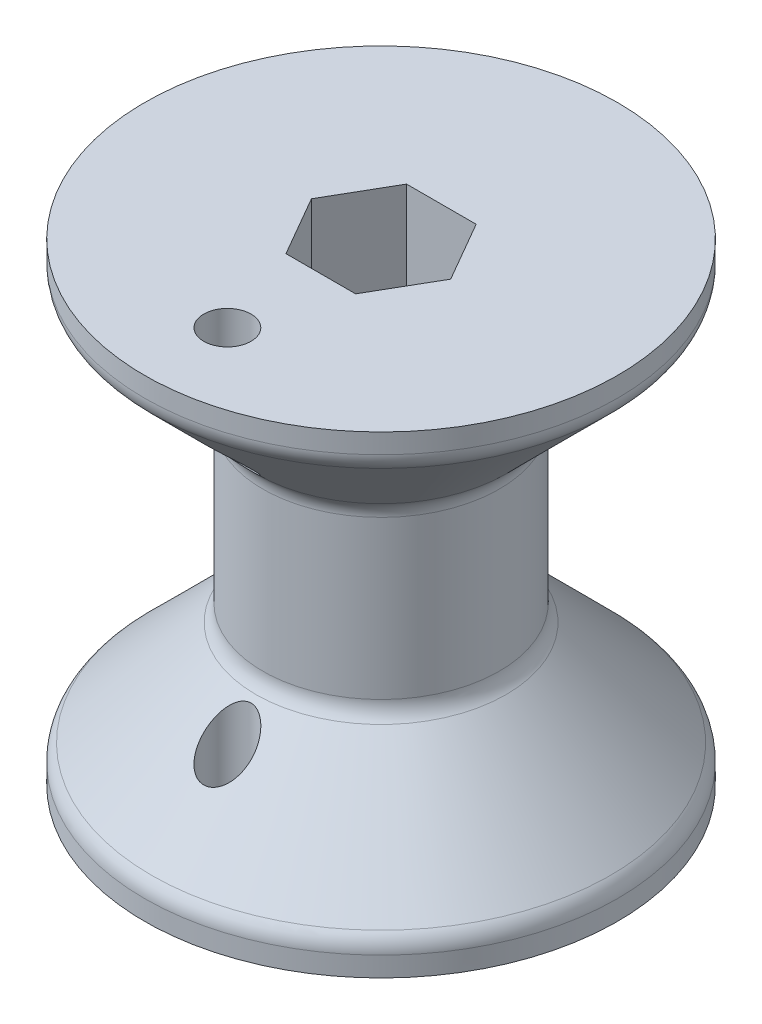
ISO-10303-21;
HEADER;
FILE_DESCRIPTION(('STEP AP214'),'2;1');
FILE_NAME('part.step','',(''),(''),'','','');
FILE_SCHEMA(('AUTOMOTIVE_DESIGN { 1 0 10303 214 1 1 1 1 }'));
ENDSEC;
DATA;
#1=APPLICATION_CONTEXT('core data for automotive mechanical design processes');
#2=APPLICATION_PROTOCOL_DEFINITION('international standard','automotive_design',2000,#1);
#3=PRODUCT_CONTEXT('',#1,'mechanical');
#4=PRODUCT('Part','Part','',(#3));
#5=PRODUCT_RELATED_PRODUCT_CATEGORY('part','',(#4));
#6=PRODUCT_DEFINITION_FORMATION('','',#4);
#7=PRODUCT_DEFINITION_CONTEXT('part definition',#1,'design');
#8=PRODUCT_DEFINITION('design','',#6,#7);
#9=PRODUCT_DEFINITION_SHAPE('','',#8);
#10=(LENGTH_UNIT() NAMED_UNIT(*) SI_UNIT(.MILLI.,.METRE.));
#11=(NAMED_UNIT(*) PLANE_ANGLE_UNIT() SI_UNIT($,.RADIAN.));
#12=(NAMED_UNIT(*) SI_UNIT($,.STERADIAN.) SOLID_ANGLE_UNIT());
#13=UNCERTAINTY_MEASURE_WITH_UNIT(LENGTH_MEASURE(1.E-05),#10,'distance_accuracy_value','');
#14=(GEOMETRIC_REPRESENTATION_CONTEXT(3) GLOBAL_UNCERTAINTY_ASSIGNED_CONTEXT((#13)) GLOBAL_UNIT_ASSIGNED_CONTEXT((#10,
#11,#12)) REPRESENTATION_CONTEXT('',''));
#15=CARTESIAN_POINT('',(0.,0.,0.));
#16=DIRECTION('',(0.,0.,1.));
#17=DIRECTION('',(1.,0.,0.));
#18=AXIS2_PLACEMENT_3D('',#15,#16,#17);
#19=CARTESIAN_POINT('',(0.,25.4,0.));
#20=DIRECTION('',(0.,1.,0.));
#21=DIRECTION('',(0.,0.,1.));
#22=AXIS2_PLACEMENT_3D('',#19,#20,#21);
#23=PLANE('',#22);
#24=DIRECTION('',(-0.5,0.,0.866025403784439));
#25=VECTOR('',#24,1.);
#26=CARTESIAN_POINT('',(-3.73949769354121,25.4,-6.47700000000001));
#27=LINE('',#26,#25);
#28=CARTESIAN_POINT('',(-3.73949769354121,25.4,-6.47700000000001));
#29=VERTEX_POINT('',#28);
#30=CARTESIAN_POINT('',(-7.47899538708242,25.4,0.));
#31=VERTEX_POINT('',#30);
#32=EDGE_CURVE('E52',#29,#31,#27,.T.);
#33=ORIENTED_EDGE('',*,*,#32,.F.);
#34=DIRECTION('',(-1.,0.,0.));
#35=VECTOR('',#34,1.);
#36=CARTESIAN_POINT('',(3.7394976935412,25.4,-6.47700000000001));
#37=LINE('',#36,#35);
#38=CARTESIAN_POINT('',(3.7394976935412,25.4,-6.47700000000001));
#39=VERTEX_POINT('',#38);
#40=EDGE_CURVE('E109',#39,#29,#37,.T.);
#41=ORIENTED_EDGE('',*,*,#40,.F.);
#42=DIRECTION('',(-0.5,0.,-0.866025403784438));
#43=VECTOR('',#42,1.);
#44=CARTESIAN_POINT('',(7.47899538708242,25.4,0.));
#45=LINE('',#44,#43);
#46=CARTESIAN_POINT('',(7.47899538708242,25.4,0.));
#47=VERTEX_POINT('',#46);
#48=EDGE_CURVE('E112',#47,#39,#45,.T.);
#49=ORIENTED_EDGE('',*,*,#48,.F.);
#50=DIRECTION('',(0.5,0.,-0.866025403784439));
#51=VECTOR('',#50,1.);
#52=CARTESIAN_POINT('',(3.73949769354121,25.4,6.477));
#53=LINE('',#52,#51);
#54=CARTESIAN_POINT('',(3.73949769354121,25.4,6.477));
#55=VERTEX_POINT('',#54);
#56=EDGE_CURVE('E129',#55,#47,#53,.T.);
#57=ORIENTED_EDGE('',*,*,#56,.F.);
#58=DIRECTION('',(1.,0.,0.));
#59=VECTOR('',#58,1.);
#60=CARTESIAN_POINT('',(-3.73949769354121,25.4,6.477));
#61=LINE('',#60,#59);
#62=CARTESIAN_POINT('',(-3.73949769354121,25.4,6.477));
#63=VERTEX_POINT('',#62);
#64=EDGE_CURVE('E126',#63,#55,#61,.T.);
#65=ORIENTED_EDGE('',*,*,#64,.F.);
#66=DIRECTION('',(0.5,0.,0.866025403784439));
#67=VECTOR('',#66,1.);
#68=CARTESIAN_POINT('',(-7.47899538708242,25.4,0.));
#69=LINE('',#68,#67);
#70=EDGE_CURVE('E123',#31,#63,#69,.T.);
#71=ORIENTED_EDGE('',*,*,#70,.F.);
#72=EDGE_LOOP('',(#33,#41,#49,#57,#65,#71));
#73=FACE_BOUND('',#72,.T.);
#74=CARTESIAN_POINT('',(0.,25.4,16.51));
#75=DIRECTION('',(0.,1.,0.));
#76=DIRECTION('',(0.,0.,1.));
#77=AXIS2_PLACEMENT_3D('',#74,#75,#76);
#78=CIRCLE('',#77,2.54);
#79=CARTESIAN_POINT('',(0.,25.4,19.05));
#80=VERTEX_POINT('',#79);
#81=EDGE_CURVE('E146',#80,#80,#78,.T.);
#82=ORIENTED_EDGE('',*,*,#81,.F.);
#83=EDGE_LOOP('',(#82));
#84=FACE_BOUND('',#83,.T.);
#85=CARTESIAN_POINT('',(0.,25.4,0.));
#86=DIRECTION('',(0.,-1.,0.));
#87=DIRECTION('',(0.,0.,-1.));
#88=AXIS2_PLACEMENT_3D('',#85,#86,#87);
#89=CIRCLE('',#88,25.4);
#90=CARTESIAN_POINT('',(0.,25.4,-25.4));
#91=VERTEX_POINT('',#90);
#92=EDGE_CURVE('E181',#91,#91,#89,.T.);
#93=ORIENTED_EDGE('',*,*,#92,.F.);
#94=EDGE_LOOP('',(#93));
#95=FACE_BOUND('',#94,.T.);
#96=ADVANCED_FACE('F37',(#73,#84,#95),#23,.T.);
#97=CARTESIAN_POINT('',(0.,0.,0.));
#98=DIRECTION('',(0.,-1.,0.));
#99=DIRECTION('',(0.,0.,-1.));
#100=AXIS2_PLACEMENT_3D('',#97,#98,#99);
#101=CYLINDRICAL_SURFACE('',#100,25.4);
#102=CARTESIAN_POINT('',(0.,23.2771024484277,0.));
#103=DIRECTION('',(0.,1.,0.));
#104=DIRECTION('',(0.,0.,1.));
#105=AXIS2_PLACEMENT_3D('',#102,#103,#104);
#106=CIRCLE('',#105,25.4);
#107=CARTESIAN_POINT('',(0.,23.2771024484277,25.4));
#108=VERTEX_POINT('',#107);
#109=EDGE_CURVE('E45',#108,#108,#106,.T.);
#110=ORIENTED_EDGE('',*,*,#109,.T.);
#111=EDGE_LOOP('',(#110));
#112=FACE_BOUND('',#111,.T.);
#113=ORIENTED_EDGE('',*,*,#92,.T.);
#114=EDGE_LOOP('',(#113));
#115=FACE_BOUND('',#114,.T.);
#116=ADVANCED_FACE('F202',(#112,#115),#101,.T.);
#117=CARTESIAN_POINT('',(0.,9.52500000000003,0.));
#118=DIRECTION('',(0.,1.,0.));
#119=DIRECTION('',(0.,0.,1.));
#120=AXIS2_PLACEMENT_3D('',#117,#118,#119);
#121=CONICAL_SURFACE('',#120,12.7,0.78539816339745);
#122=CARTESIAN_POINT('',(0.,10.2689487757862,0.));
#123=DIRECTION('',(0.,1.,0.));
#124=DIRECTION('',(0.,0.,1.));
#125=AXIS2_PLACEMENT_3D('',#122,#123,#124);
#126=CIRCLE('',#125,13.4439487757862);
#127=CARTESIAN_POINT('',(0.,10.2689487757862,13.4439487757862));
#128=VERTEX_POINT('',#127);
#129=EDGE_CURVE('E197',#128,#128,#126,.T.);
#130=ORIENTED_EDGE('',*,*,#129,.T.);
#131=EDGE_LOOP('',(#130));
#132=FACE_BOUND('',#131,.T.);
#133=CARTESIAN_POINT('',(0.,21.4810512242138,0.));
#134=DIRECTION('',(0.,-1.,0.));
#135=DIRECTION('',(0.,0.,-1.));
#136=AXIS2_PLACEMENT_3D('',#133,#134,#135);
#137=CIRCLE('',#136,24.6560512242138);
#138=CARTESIAN_POINT('',(0.,21.4810512242138,-24.6560512242138));
#139=VERTEX_POINT('',#138);
#140=EDGE_CURVE('E194',#139,#139,#137,.T.);
#141=ORIENTED_EDGE('',*,*,#140,.T.);
#142=EDGE_LOOP('',(#141));
#143=FACE_BOUND('',#142,.T.);
#144=CARTESIAN_POINT('',(-1.30213218323772,11.2132055122847,14.3291611801462));
#145=CARTESIAN_POINT('',(-1.21914973875307,11.1563577149583,14.2796179845781));
#146=CARTESIAN_POINT('',(-1.13143632781732,11.1032793761864,14.233659280017));
#147=CARTESIAN_POINT('',(-0.946591137934634,11.0071483537464,14.1508038722713));
#148=CARTESIAN_POINT('',(-0.849461886110524,10.9640929905001,14.1139047469219));
#149=CARTESIAN_POINT('',(-0.645759834902397,10.8906002970199,14.0511273981558));
#150=CARTESIAN_POINT('',(-0.539097324176534,10.860302515397,14.0253709794981));
#151=CARTESIAN_POINT('',(-0.320083764626517,10.8160540235673,13.9878128629933));
#152=CARTESIAN_POINT('',(-0.207741497774353,10.8020788361032,13.9759902698287));
#153=CARTESIAN_POINT('',(0.00463253054322886,10.7927003845005,13.9680539929217));
#154=CARTESIAN_POINT('',(0.104515008313534,10.795260622735,13.9702177804299));
#155=CARTESIAN_POINT('',(0.302057493072186,10.8139915829359,13.9860781599932));
#156=CARTESIAN_POINT('',(0.399716941973742,10.8301656847621,13.9997776159632));
#157=CARTESIAN_POINT('',(0.584749804878773,10.8734142515183,14.0365237791391));
#158=CARTESIAN_POINT('',(0.672393312178411,10.899834710608,14.0590101877846));
#159=CARTESIAN_POINT('',(0.84182365437426,10.9617543998776,14.1119128912153));
#160=CARTESIAN_POINT('',(0.923608500483415,10.9972566944677,14.1423318626882));
#161=CARTESIAN_POINT('',(1.12408504518909,11.0972571020511,14.2284120236306));
#162=CARTESIAN_POINT('',(1.23819537731323,11.1669367542969,14.2887328506322));
#163=CARTESIAN_POINT('',(1.45043921176992,11.3185026988092,14.4210879884385));
#164=CARTESIAN_POINT('',(1.54852814403644,11.4004218691675,14.4931538980298));
#165=CARTESIAN_POINT('',(1.77130166281646,11.6122950820827,14.6813106001247));
#166=CARTESIAN_POINT('',(1.88731139758535,11.7469450388043,14.8023498440219));
#167=CARTESIAN_POINT('',(2.08971653166537,12.0261042098922,15.0570095698019));
#168=CARTESIAN_POINT('',(2.17606686854588,12.1706280300428,15.1906488060949));
#169=CARTESIAN_POINT('',(2.29563599054754,12.4132015112736,15.4182728856742));
#170=CARTESIAN_POINT('',(2.33686801145495,12.5097766048632,15.509730140138));
#171=CARTESIAN_POINT('',(2.40796487005604,12.7042408707439,15.695618121358));
#172=CARTESIAN_POINT('',(2.43782648851076,12.8021304070768,15.7900496820317));
#173=CARTESIAN_POINT('',(2.51058704277444,13.0968014004098,16.0769728823188));
#174=CARTESIAN_POINT('',(2.53666114431542,13.2945841352587,16.2730920031945));
#175=CARTESIAN_POINT('',(2.54122884940606,13.5892367939077,16.5705116898518));
#176=CARTESIAN_POINT('',(2.53691695316006,13.6874612428122,16.6705514180429));
#177=CARTESIAN_POINT('',(2.51625553594526,13.8824357573659,16.8708388378816));
#178=CARTESIAN_POINT('',(2.49990387816774,13.979185558184,16.9710865632946));
#179=CARTESIAN_POINT('',(2.43208557009613,14.2657362714508,17.2704920488992));
#180=CARTESIAN_POINT('',(2.36187208448898,14.4524923349533,17.4689732560816));
#181=CARTESIAN_POINT('',(2.20072467464285,14.7464026739209,17.7859361634635));
#182=CARTESIAN_POINT('',(2.12569352669345,14.858503689282,17.9080619434272));
#183=CARTESIAN_POINT('',(1.9507859331249,15.0725265032475,18.1432274507606));
#184=CARTESIAN_POINT('',(1.85094578883275,15.1744628723731,18.2562801372075));
#185=CARTESIAN_POINT('',(1.6495992371107,15.3436200154977,18.4452514751221));
#186=CARTESIAN_POINT('',(1.55302300882151,15.413601383906,18.523939114725));
#187=CARTESIAN_POINT('',(1.34409319790177,15.5419652401155,18.6689636884527));
#188=CARTESIAN_POINT('',(1.23175812381553,15.6003611433816,18.7353149019579));
#189=CARTESIAN_POINT('',(1.01315138647806,15.693744643535,18.8417994330508));
#190=CARTESIAN_POINT('',(0.909104218279211,15.7310249779408,18.8844732379608));
#191=CARTESIAN_POINT('',(0.692999623277539,15.793628212432,18.9562801584605));
#192=CARTESIAN_POINT('',(0.580946533831816,15.8189575314841,18.9854205428049));
#193=CARTESIAN_POINT('',(0.351140130421297,15.8562255731767,19.02833702905));
#194=CARTESIAN_POINT('',(0.233361638586016,15.8680982598893,19.0420373599055));
#195=CARTESIAN_POINT('',(-0.0035182675800703,15.8773928418893,19.0527603731164));
#196=CARTESIAN_POINT('',(-0.12261935521475,15.8748182299227,19.0497870864476));
#197=CARTESIAN_POINT('',(-0.348249445000713,15.8562312924504,19.0283523783546));
#198=CARTESIAN_POINT('',(-0.455002075093826,15.8413508141862,19.0111955494403));
#199=CARTESIAN_POINT('',(-0.663412847682085,15.800470368187,18.964159943528));
#200=CARTESIAN_POINT('',(-0.765070622899478,15.7744696000972,18.9342802508345));
#201=CARTESIAN_POINT('',(-0.965359263165174,15.7113160392668,18.8619140846544));
#202=CARTESIAN_POINT('',(-1.06368032990805,15.6737381429365,18.8189479250198));
#203=CARTESIAN_POINT('',(-1.25109205105706,15.5895283579198,18.7230238627116));
#204=CARTESIAN_POINT('',(-1.34017744284913,15.542891350246,18.6700603113416));
#205=CARTESIAN_POINT('',(-1.54627020280473,15.419439266011,18.5304776254792));
#206=CARTESIAN_POINT('',(-1.65781901922235,15.3384843643351,18.4394342163037));
#207=CARTESIAN_POINT('',(-1.85973357850447,15.1649062643701,18.2457020749646));
#208=CARTESIAN_POINT('',(-1.95005505684186,15.0722592922697,18.1429896595869));
#209=CARTESIAN_POINT('',(-2.13656669289193,14.8466138434096,17.8949295734291));
#210=CARTESIAN_POINT('',(-2.22492820362869,14.7103613698622,17.7466646649455));
#211=CARTESIAN_POINT('',(-2.36821304532999,14.4282568571715,17.4434628878665));
#212=CARTESIAN_POINT('',(-2.42309681691169,14.2823936859678,17.2885183566925));
#213=CARTESIAN_POINT('',(-2.51189001158963,13.9473538663017,16.9372777911961));
#214=CARTESIAN_POINT('',(-2.53706185037015,13.7565044962832,16.7403756804319));
#215=CARTESIAN_POINT('',(-2.54245851240623,13.3709033387047,16.3494310325797));
#216=CARTESIAN_POINT('',(-2.52262639965558,13.1761469171206,16.1553924307563));
#217=CARTESIAN_POINT('',(-2.45997690736623,12.8844588225694,15.8699297287801));
#218=CARTESIAN_POINT('',(-2.43342926567235,12.7868969846118,15.7753244371366));
#219=CARTESIAN_POINT('',(-2.36912298539862,12.5927959855291,15.5888096632922));
#220=CARTESIAN_POINT('',(-2.33136206537121,12.4962570366642,15.496900733877));
#221=CARTESIAN_POINT('',(-2.24444154067374,12.3051930993541,15.3166493201671));
#222=CARTESIAN_POINT('',(-2.19529426618366,12.2106660522794,15.2283030984856));
#223=CARTESIAN_POINT('',(-2.08516711149759,12.0246444956992,15.0559976484131));
#224=CARTESIAN_POINT('',(-2.02419411996753,11.9331482568538,14.9720359019627));
#225=CARTESIAN_POINT('',(-1.86986352045321,11.7280834548191,14.7854952056163));
#226=CARTESIAN_POINT('',(-1.7722604572548,11.6159821878262,14.684746620347));
#227=CARTESIAN_POINT('',(-1.55443474764784,11.4038265350494,14.4960478095669));
#228=CARTESIAN_POINT('',(-1.43428253764425,11.3037361854961,14.4080592036187));
#229=CARTESIAN_POINT('',(-1.30213218323772,11.2132055122847,14.3291611801462));
#230=B_SPLINE_CURVE_WITH_KNOTS('',3,(#144,#145,#146,#147,#148,#149,#150,#151,#152,#153,#154,
#155,#156,#157,#158,#159,#160,#161,#162,#163,#164,#165,#166,#167,#168,#169,#170,#171,#172,#173,
#174,#175,#176,#177,#178,#179,#180,#181,#182,#183,#184,#185,#186,#187,#188,#189,#190,#191,#192,
#193,#194,#195,#196,#197,#198,#199,#200,#201,#202,#203,#204,#205,#206,#207,#208,#209,#210,#211,
#212,#213,#214,#215,#216,#217,#218,#219,#220,#221,#222,#223,#224,#225,#226,#227,#228,#229),
.UNSPECIFIED.,.T.,.F.,(4,2,2,2,2,2,2,2,2,2,2,2,2,2,2,2,2,2,2,2,2,2,2,2,2,2,2,2,2,2,2,2,2,2,2,2,
2,2,2,2,2,2,4),(0.,0.336084003143431,0.672078052936662,1.01165746684225,1.35072699314995,
1.64890509523808,1.94715724666196,2.22887483701376,2.51068761072153,2.94823918430567,
3.38698798503502,4.02861367588933,4.67120994032503,5.08847111342033,5.50585033567018,
6.34061354673386,6.76097961527939,7.18142030809885,8.01954758066094,8.5637373004787,
9.10713538544487,9.53423013057073,9.9608273943684,10.314786513178,10.6685553012491,
11.0240527277929,11.3794642137933,11.7054078066518,12.0313748624252,12.3711265329531,
12.7110707467059,13.2038834301676,13.6977148148911,14.3538594949012,15.0107780218871,
15.8327900178773,16.6558425484723,17.0708534344151,17.4859488161695,17.9005967787396,
18.3150039238949,18.8518708872825,19.3870879491755),.UNSPECIFIED.);
#231=CARTESIAN_POINT('',(-1.30213218323772,11.2132055122847,14.3291611801462));
#232=VERTEX_POINT('',#231);
#233=EDGE_CURVE('E149',#232,#232,#230,.T.);
#234=ORIENTED_EDGE('',*,*,#233,.F.);
#235=EDGE_LOOP('',(#234));
#236=FACE_BOUND('',#235,.T.);
#237=ADVANCED_FACE('F159',(#132,#143,#236),#121,.T.);
#238=CARTESIAN_POINT('',(0.,0.,0.));
#239=DIRECTION('',(0.,-1.,0.));
#240=DIRECTION('',(0.,0.,-1.));
#241=AXIS2_PLACEMENT_3D('',#238,#239,#240);
#242=CYLINDRICAL_SURFACE('',#241,12.7);
#243=CARTESIAN_POINT('',(0.,-8.47289755157236,0.));
#244=DIRECTION('',(0.,-1.,0.));
#245=DIRECTION('',(0.,0.,-1.));
#246=AXIS2_PLACEMENT_3D('',#243,#244,#245);
#247=CIRCLE('',#246,12.7);
#248=CARTESIAN_POINT('',(0.,-8.47289755157236,-12.7));
#249=VERTEX_POINT('',#248);
#250=EDGE_CURVE('E191',#249,#249,#247,.F.);
#251=ORIENTED_EDGE('',*,*,#250,.T.);
#252=EDGE_LOOP('',(#251));
#253=FACE_BOUND('',#252,.T.);
#254=CARTESIAN_POINT('',(0.,8.47289755157236,0.));
#255=DIRECTION('',(0.,-1.,0.));
#256=DIRECTION('',(0.,0.,-1.));
#257=AXIS2_PLACEMENT_3D('',#254,#255,#256);
#258=CIRCLE('',#257,12.7);
#259=CARTESIAN_POINT('',(0.,8.47289755157236,-12.7));
#260=VERTEX_POINT('',#259);
#261=EDGE_CURVE('E188',#260,#260,#258,.T.);
#262=ORIENTED_EDGE('',*,*,#261,.T.);
#263=EDGE_LOOP('',(#262));
#264=FACE_BOUND('',#263,.T.);
#265=ADVANCED_FACE('F213',(#253,#264),#242,.T.);
#266=CARTESIAN_POINT('',(0.,-25.4,0.));
#267=DIRECTION('',(0.,-1.,0.));
#268=DIRECTION('',(0.,0.,1.));
#269=AXIS2_PLACEMENT_3D('',#266,#267,#268);
#270=PLANE('',#269);
#271=DIRECTION('',(-0.5,0.,0.866025403784439));
#272=VECTOR('',#271,1.);
#273=CARTESIAN_POINT('',(-3.73949769354121,-25.4,-6.47700000000001));
#274=LINE('',#273,#272);
#275=CARTESIAN_POINT('',(-3.73949769354121,-25.4,-6.47700000000001));
#276=VERTEX_POINT('',#275);
#277=CARTESIAN_POINT('',(-7.47899538708242,-25.4,0.));
#278=VERTEX_POINT('',#277);
#279=EDGE_CURVE('E92',#276,#278,#274,.T.);
#280=ORIENTED_EDGE('',*,*,#279,.T.);
#281=DIRECTION('',(0.5,0.,0.866025403784439));
#282=VECTOR('',#281,1.);
#283=CARTESIAN_POINT('',(-7.47899538708242,-25.4,0.));
#284=LINE('',#283,#282);
#285=CARTESIAN_POINT('',(-3.73949769354121,-25.4,6.477));
#286=VERTEX_POINT('',#285);
#287=EDGE_CURVE('E101',#278,#286,#284,.T.);
#288=ORIENTED_EDGE('',*,*,#287,.T.);
#289=DIRECTION('',(1.,0.,0.));
#290=VECTOR('',#289,1.);
#291=CARTESIAN_POINT('',(-3.73949769354121,-25.4,6.477));
#292=LINE('',#291,#290);
#293=CARTESIAN_POINT('',(3.73949769354121,-25.4,6.477));
#294=VERTEX_POINT('',#293);
#295=EDGE_CURVE('E60',#286,#294,#292,.T.);
#296=ORIENTED_EDGE('',*,*,#295,.T.);
#297=DIRECTION('',(0.5,0.,-0.866025403784439));
#298=VECTOR('',#297,1.);
#299=CARTESIAN_POINT('',(3.73949769354121,-25.4,6.477));
#300=LINE('',#299,#298);
#301=CARTESIAN_POINT('',(7.47899538708242,-25.4,0.));
#302=VERTEX_POINT('',#301);
#303=EDGE_CURVE('E116',#294,#302,#300,.T.);
#304=ORIENTED_EDGE('',*,*,#303,.T.);
#305=DIRECTION('',(-0.5,0.,-0.866025403784438));
#306=VECTOR('',#305,1.);
#307=CARTESIAN_POINT('',(7.47899538708242,-25.4,0.));
#308=LINE('',#307,#306);
#309=CARTESIAN_POINT('',(3.7394976935412,-25.4,-6.47700000000001));
#310=VERTEX_POINT('',#309);
#311=EDGE_CURVE('E119',#302,#310,#308,.T.);
#312=ORIENTED_EDGE('',*,*,#311,.T.);
#313=DIRECTION('',(-1.,0.,0.));
#314=VECTOR('',#313,1.);
#315=CARTESIAN_POINT('',(3.7394976935412,-25.4,-6.47700000000001));
#316=LINE('',#315,#314);
#317=EDGE_CURVE('E98',#310,#276,#316,.T.);
#318=ORIENTED_EDGE('',*,*,#317,.T.);
#319=EDGE_LOOP('',(#280,#288,#296,#304,#312,#318));
#320=FACE_BOUND('',#319,.T.);
#321=CARTESIAN_POINT('',(0.,-25.4,16.51));
#322=DIRECTION('',(0.,1.,0.));
#323=DIRECTION('',(0.,0.,1.));
#324=AXIS2_PLACEMENT_3D('',#321,#322,#323);
#325=CIRCLE('',#324,2.54);
#326=CARTESIAN_POINT('',(0.,-25.4,19.05));
#327=VERTEX_POINT('',#326);
#328=EDGE_CURVE('E124',#327,#327,#325,.T.);
#329=ORIENTED_EDGE('',*,*,#328,.T.);
#330=EDGE_LOOP('',(#329));
#331=FACE_BOUND('',#330,.T.);
#332=CARTESIAN_POINT('',(0.,-25.4,0.));
#333=DIRECTION('',(0.,-1.,0.));
#334=DIRECTION('',(0.,0.,-1.));
#335=AXIS2_PLACEMENT_3D('',#332,#333,#334);
#336=CIRCLE('',#335,25.4);
#337=CARTESIAN_POINT('',(0.,-25.4,-25.4));
#338=VERTEX_POINT('',#337);
#339=EDGE_CURVE('E157',#338,#338,#336,.T.);
#340=ORIENTED_EDGE('',*,*,#339,.T.);
#341=EDGE_LOOP('',(#340));
#342=FACE_BOUND('',#341,.T.);
#343=ADVANCED_FACE('F105',(#320,#331,#342),#270,.T.);
#344=CARTESIAN_POINT('',(0.,0.,0.));
#345=DIRECTION('',(0.,1.,0.));
#346=DIRECTION('',(0.,0.,-1.));
#347=AXIS2_PLACEMENT_3D('',#344,#345,#346);
#348=CYLINDRICAL_SURFACE('',#347,25.4);
#349=CARTESIAN_POINT('',(0.,-23.2771024484277,0.));
#350=DIRECTION('',(0.,1.,0.));
#351=DIRECTION('',(0.,0.,1.));
#352=AXIS2_PLACEMENT_3D('',#349,#350,#351);
#353=CIRCLE('',#352,25.4);
#354=CARTESIAN_POINT('',(0.,-23.2771024484277,25.4));
#355=VERTEX_POINT('',#354);
#356=EDGE_CURVE('E11',#355,#355,#353,.F.);
#357=ORIENTED_EDGE('',*,*,#356,.T.);
#358=EDGE_LOOP('',(#357));
#359=FACE_BOUND('',#358,.T.);
#360=ORIENTED_EDGE('',*,*,#339,.F.);
#361=EDGE_LOOP('',(#360));
#362=FACE_BOUND('',#361,.T.);
#363=ADVANCED_FACE('F232',(#359,#362),#348,.T.);
#364=CARTESIAN_POINT('',(0.,-9.52500000000003,0.));
#365=DIRECTION('',(0.,-1.,0.));
#366=DIRECTION('',(0.,0.,1.));
#367=AXIS2_PLACEMENT_3D('',#364,#365,#366);
#368=CONICAL_SURFACE('',#367,12.7,0.78539816339745);
#369=CARTESIAN_POINT('',(0.,-10.2689487757862,0.));
#370=DIRECTION('',(0.,-1.,0.));
#371=DIRECTION('',(0.,0.,-1.));
#372=AXIS2_PLACEMENT_3D('',#369,#370,#371);
#373=CIRCLE('',#372,13.4439487757862);
#374=CARTESIAN_POINT('',(0.,-10.2689487757862,-13.4439487757862));
#375=VERTEX_POINT('',#374);
#376=EDGE_CURVE('E185',#375,#375,#373,.T.);
#377=ORIENTED_EDGE('',*,*,#376,.T.);
#378=EDGE_LOOP('',(#377));
#379=FACE_BOUND('',#378,.T.);
#380=CARTESIAN_POINT('',(0.,-21.4810512242138,0.));
#381=DIRECTION('',(0.,1.,0.));
#382=DIRECTION('',(0.,0.,1.));
#383=AXIS2_PLACEMENT_3D('',#380,#381,#382);
#384=CIRCLE('',#383,24.6560512242138);
#385=CARTESIAN_POINT('',(0.,-21.4810512242138,24.6560512242138));
#386=VERTEX_POINT('',#385);
#387=EDGE_CURVE('E182',#386,#386,#384,.T.);
#388=ORIENTED_EDGE('',*,*,#387,.T.);
#389=EDGE_LOOP('',(#388));
#390=FACE_BOUND('',#389,.T.);
#391=CARTESIAN_POINT('',(-1.27953994775293,-15.5728841416755,18.7041689821225));
#392=CARTESIAN_POINT('',(-1.18625658681635,-15.6207831266767,18.7585609400604));
#393=CARTESIAN_POINT('',(-1.08767255480377,-15.6641939673447,18.8080648913507));
#394=CARTESIAN_POINT('',(-0.881170617496753,-15.7401312280912,18.8948889387065));
#395=CARTESIAN_POINT('',(-0.773242866820356,-15.7726459870239,18.9321959804263));
#396=CARTESIAN_POINT('',(-0.549813179153353,-15.8251091002163,18.9924877879815));
#397=CARTESIAN_POINT('',(-0.434274549089056,-15.8449907782879,19.0153965543116));
#398=CARTESIAN_POINT('',(-0.199635091909141,-15.8705813693937,19.0448969488585));
#399=CARTESIAN_POINT('',(-0.0805370569783457,-15.8763011110212,19.0515010440496));
#400=CARTESIAN_POINT('',(0.14874371223337,-15.8733079157085,19.0480478197441));
#401=CARTESIAN_POINT('',(0.258959827112315,-15.8655895566278,19.039138658205));
#402=CARTESIAN_POINT('',(0.475810403137653,-15.8380854829303,19.0074419599034));
#403=CARTESIAN_POINT('',(0.582444462263898,-15.8182984185647,18.9846528708277));
#404=CARTESIAN_POINT('',(0.789444193303332,-15.7677651083241,18.9265966130025));
#405=CARTESIAN_POINT('',(0.889811324515754,-15.7370214250451,18.8913323620285));
#406=CARTESIAN_POINT('',(1.08250911990753,-15.6660238034246,18.810158007797));
#407=CARTESIAN_POINT('',(1.1748360995602,-15.6257655359336,18.7642430586333));
#408=CARTESIAN_POINT('',(1.38475238210672,-15.5199013156816,18.6439754068147));
#409=CARTESIAN_POINT('',(1.49810839644231,-15.4505385955822,18.565522400457));
#410=CARTESIAN_POINT('',(1.70627896602938,-15.2999679146623,18.3963428817797));
#411=CARTESIAN_POINT('',(1.80105802378687,-15.2187377840563,18.3055934217028));
#412=CARTESIAN_POINT('',(1.99997747866846,-15.0197161941972,18.0849007356675));
#413=CARTESIAN_POINT('',(2.09724002915011,-14.8985941850609,17.9517707305323));
#414=CARTESIAN_POINT('',(2.26162906244372,-14.6460066426491,17.6771869982346));
#415=CARTESIAN_POINT('',(2.32871485301921,-14.5145274219582,17.5357223208843));
#416=CARTESIAN_POINT('',(2.45040660233582,-14.2055184425155,17.2071707114973));
#417=CARTESIAN_POINT('',(2.49573754019849,-14.0256996396824,17.0187604035781));
#418=CARTESIAN_POINT('',(2.53166013009206,-13.7518929241798,16.7365161607139));
#419=CARTESIAN_POINT('',(2.53827995002197,-13.6598574916168,16.642409990505));
#420=CARTESIAN_POINT('',(2.54113205764867,-13.4749300097277,16.4548794403233));
#421=CARTESIAN_POINT('',(2.53736404148057,-13.3820379354224,16.3614550803751));
#422=CARTESIAN_POINT('',(2.5105807270091,-13.1005899878397,16.0808006739895));
#423=CARTESIAN_POINT('',(2.47181866592132,-12.9113853724737,15.8953798204473));
#424=CARTESIAN_POINT('',(2.3827084379189,-12.6305826732672,15.6249571949698));
#425=CARTESIAN_POINT('',(2.34783890694226,-12.5374735054399,15.5360927697567));
#426=CARTESIAN_POINT('',(2.26753694194143,-12.3529102080515,15.3614780139217));
#427=CARTESIAN_POINT('',(2.22210788321278,-12.2614555596792,15.2757266983166));
#428=CARTESIAN_POINT('',(2.09673984442827,-12.0392598962044,15.0691951308685));
#429=CARTESIAN_POINT('',(2.0105626729612,-11.9099422607708,14.9505866524167));
#430=CARTESIAN_POINT('',(1.81308209220608,-11.6608109624828,14.7248444979726));
#431=CARTESIAN_POINT('',(1.70182100286045,-11.5409817462489,14.617691938069));
#432=CARTESIAN_POINT('',(1.48978756506817,-11.3511754194516,14.4497922395577));
#433=CARTESIAN_POINT('',(1.39605699761355,-11.2770965611635,14.3848234880211));
#434=CARTESIAN_POINT('',(1.19467455647103,-11.1400732443314,14.2654499605166));
#435=CARTESIAN_POINT('',(1.087044184591,-11.0771119367753,14.2110291863028));
#436=CARTESIAN_POINT('',(0.883952987587625,-10.9792089325469,14.1268406707641));
#437=CARTESIAN_POINT('',(0.791170661719917,-10.9411500112182,14.0942812371622));
#438=CARTESIAN_POINT('',(0.598632428846866,-10.8769675723883,14.0395293051436));
#439=CARTESIAN_POINT('',(0.498882774235203,-10.8508335083874,14.0173276457848));
#440=CARTESIAN_POINT('',(0.293923779847933,-10.812633018021,13.9849180623835));
#441=CARTESIAN_POINT('',(0.188678069421078,-10.8006773679209,13.9748045787682));
#442=CARTESIAN_POINT('',(-0.0228496206197756,-10.7925220110125,13.9679027431288));
#443=CARTESIAN_POINT('',(-0.12913115087238,-10.79631575096,13.9711088488891));
#444=CARTESIAN_POINT('',(-0.326352654257183,-10.8178380289811,13.9893377041562));
#445=CARTESIAN_POINT('',(-0.417623854563629,-10.8338706367547,14.0029224651963));
#446=CARTESIAN_POINT('',(-0.595744523458899,-10.8765340229675,14.0391779234923));
#447=CARTESIAN_POINT('',(-0.682592010563683,-10.9031695044033,14.0618526527142));
#448=CARTESIAN_POINT('',(-0.881072121502465,-10.9766889772225,14.1246826673356));
#449=CARTESIAN_POINT('',(-0.990212752877737,-11.0274144831724,14.1681967366118));
#450=CARTESIAN_POINT('',(-1.1963308120492,-11.1411818610585,14.2664540418086));
#451=CARTESIAN_POINT('',(-1.29328192314035,-11.20424965423,14.3212209231495));
#452=CARTESIAN_POINT('',(-1.51516402750926,-11.3690379558567,14.4654193339815));
#453=CARTESIAN_POINT('',(-1.63352115099443,-11.475521722701,14.5594731083442));
#454=CARTESIAN_POINT('',(-1.84672393539342,-11.6997298336769,14.7599466250576));
#455=CARTESIAN_POINT('',(-1.94152348509557,-11.8174756079424,14.8663900302023));
#456=CARTESIAN_POINT('',(-2.08440541182867,-12.0237545601472,15.0552197816157));
#457=CARTESIAN_POINT('',(-2.13800367894974,-12.1105906759758,15.1353743439175));
#458=CARTESIAN_POINT('',(-2.23490586298444,-12.2866032532184,15.2992703336374));
#459=CARTESIAN_POINT('',(-2.27820580932857,-12.3757806026401,15.383013129879));
#460=CARTESIAN_POINT('',(-2.39319701141372,-12.6456682932999,15.638699371656));
#461=CARTESIAN_POINT('',(-2.44999464626161,-12.82875667267,15.8151211217126));
#462=CARTESIAN_POINT('',(-2.50619848900602,-13.1056020121412,16.0865434310843));
#463=CARTESIAN_POINT('',(-2.52008935598813,-13.1991733050454,16.1790829911958));
#464=CARTESIAN_POINT('',(-2.53760954836641,-13.3860063930924,16.3654364174949));
#465=CARTESIAN_POINT('',(-2.54123929356678,-13.479268200741,16.4592502313923));
#466=CARTESIAN_POINT('',(-2.53641084834851,-13.7576037895929,16.7415910680432));
#467=CARTESIAN_POINT('',(-2.51229874274293,-13.9415390681658,16.9313228842261));
#468=CARTESIAN_POINT('',(-2.4276460379273,-14.2684729124191,17.2738169273238));
#469=CARTESIAN_POINT('',(-2.37444889493978,-14.4128777257857,17.4270828280213));
#470=CARTESIAN_POINT('',(-2.23536979876752,-14.6925498679365,17.7273893968353));
#471=CARTESIAN_POINT('',(-2.14950661722254,-14.8278223921495,17.8744335864505));
#472=CARTESIAN_POINT('',(-1.96707229398997,-15.0536758314788,18.1224559716257));
#473=CARTESIAN_POINT('',(-1.87784223671712,-15.1472579093511,18.2261014552099));
#474=CARTESIAN_POINT('',(-1.67814688773998,-15.3227154639028,18.4217549783135));
#475=CARTESIAN_POINT('',(-1.56776863813125,-15.404636605773,18.5138082407796));
#476=CARTESIAN_POINT('',(-1.3932435622823,-15.511724834671,18.6347994515054));
#477=CARTESIAN_POINT('',(-1.3374118193094,-15.5431681893358,18.6704248677179));
#478=CARTESIAN_POINT('',(-1.27953994775293,-15.5728841416755,18.7041689821225));
#479=B_SPLINE_CURVE_WITH_KNOTS('',3,(#391,#392,#393,#394,#395,#396,#397,#398,#399,#400,#401,
#402,#403,#404,#405,#406,#407,#408,#409,#410,#411,#412,#413,#414,#415,#416,#417,#418,#419,#420,
#421,#422,#423,#424,#425,#426,#427,#428,#429,#430,#431,#432,#433,#434,#435,#436,#437,#438,#439,
#440,#441,#442,#443,#444,#445,#446,#447,#448,#449,#450,#451,#452,#453,#454,#455,#456,#457,#458,
#459,#460,#461,#462,#463,#464,#465,#466,#467,#468,#469,#470,#471,#472,#473,#474,#475,#476,#477,
#478),.UNSPECIFIED.,.T.,.F.,(4,2,2,2,2,2,2,2,2,2,2,2,2,2,2,2,2,2,2,2,2,2,2,2,2,2,2,2,2,2,2,2,2,
2,2,2,2,2,2,2,2,2,2,4),(0.,0.354207361859428,0.70879259992488,1.06523409130586,1.42140295375748,
1.75231805795858,2.0832701780724,2.41414494397666,2.74517054919711,3.20559765302708,
3.66689615863794,4.27731280531847,4.88855012653487,5.67721219141227,6.07227265675259,
6.46734467852121,7.26657987623834,7.66627577632001,8.06584409105051,8.65048226678491,
9.23414136420152,9.64089948158018,10.0470357515844,10.3621522646621,10.676989541818,
10.9942707756078,11.3114200034623,11.5911712836953,11.8710467885516,12.2528467407047,
12.6354573240939,13.1871832491761,13.7399807545175,14.1287744694019,14.5177178435372,
15.2955042369186,15.692187878291,16.0888552902609,16.8808819604705,17.5302543741465,
18.1792541862468,18.6746880278833,19.1681249343487,19.3878709077363),.UNSPECIFIED.);
#480=CARTESIAN_POINT('',(-1.27953994775293,-15.5728841416755,18.7041689821225));
#481=VERTEX_POINT('',#480);
#482=EDGE_CURVE('E136',#481,#481,#479,.T.);
#483=ORIENTED_EDGE('',*,*,#482,.F.);
#484=EDGE_LOOP('',(#483));
#485=FACE_BOUND('',#484,.T.);
#486=ADVANCED_FACE('F168',(#379,#390,#485),#368,.T.);
#487=CARTESIAN_POINT('',(0.,-25.4,16.51));
#488=DIRECTION('',(0.,1.,0.));
#489=DIRECTION('',(0.,0.,1.));
#490=AXIS2_PLACEMENT_3D('',#487,#488,#489);
#491=CYLINDRICAL_SURFACE('',#490,2.54);
#492=ORIENTED_EDGE('',*,*,#482,.T.);
#493=EDGE_LOOP('',(#492));
#494=FACE_BOUND('',#493,.T.);
#495=ORIENTED_EDGE('',*,*,#328,.F.);
#496=EDGE_LOOP('',(#495));
#497=FACE_BOUND('',#496,.T.);
#498=ADVANCED_FACE('F163',(#494,#497),#491,.F.);
#499=CARTESIAN_POINT('',(-3.73949769354121,-25.4,-6.47700000000001));
#500=DIRECTION('',(-0.866025403784439,0.,-0.5));
#501=DIRECTION('',(-0.5,0.,0.866025403784439));
#502=AXIS2_PLACEMENT_3D('',#499,#500,#501);
#503=PLANE('',#502);
#504=ORIENTED_EDGE('',*,*,#32,.T.);
#505=DIRECTION('',(0.,1.,0.));
#506=VECTOR('',#505,1.);
#507=CARTESIAN_POINT('',(-7.47899538708242,-25.4,0.));
#508=LINE('',#507,#506);
#509=EDGE_CURVE('E88',#278,#31,#508,.T.);
#510=ORIENTED_EDGE('',*,*,#509,.F.);
#511=ORIENTED_EDGE('',*,*,#279,.F.);
#512=DIRECTION('',(0.,1.,0.));
#513=VECTOR('',#512,1.);
#514=CARTESIAN_POINT('',(-3.73949769354121,-25.4,-6.47700000000001));
#515=LINE('',#514,#513);
#516=EDGE_CURVE('E134',#276,#29,#515,.T.);
#517=ORIENTED_EDGE('',*,*,#516,.T.);
#518=EDGE_LOOP('',(#504,#510,#511,#517));
#519=FACE_BOUND('',#518,.T.);
#520=ADVANCED_FACE('F90',(#519),#503,.F.);
#521=CARTESIAN_POINT('',(3.7394976935412,-25.4,-6.47700000000001));
#522=DIRECTION('',(0.,0.,-1.));
#523=DIRECTION('',(-1.,0.,0.));
#524=AXIS2_PLACEMENT_3D('',#521,#522,#523);
#525=PLANE('',#524);
#526=ORIENTED_EDGE('',*,*,#40,.T.);
#527=ORIENTED_EDGE('',*,*,#516,.F.);
#528=ORIENTED_EDGE('',*,*,#317,.F.);
#529=DIRECTION('',(0.,1.,0.));
#530=VECTOR('',#529,1.);
#531=CARTESIAN_POINT('',(3.7394976935412,-25.4,-6.47700000000001));
#532=LINE('',#531,#530);
#533=EDGE_CURVE('E137',#310,#39,#532,.T.);
#534=ORIENTED_EDGE('',*,*,#533,.T.);
#535=EDGE_LOOP('',(#526,#527,#528,#534));
#536=FACE_BOUND('',#535,.T.);
#537=ADVANCED_FACE('F349',(#536),#525,.F.);
#538=CARTESIAN_POINT('',(7.47899538708242,-25.4,0.));
#539=DIRECTION('',(0.866025403784438,0.,-0.5));
#540=DIRECTION('',(-0.5,0.,-0.866025403784439));
#541=AXIS2_PLACEMENT_3D('',#538,#539,#540);
#542=PLANE('',#541);
#543=ORIENTED_EDGE('',*,*,#48,.T.);
#544=ORIENTED_EDGE('',*,*,#533,.F.);
#545=ORIENTED_EDGE('',*,*,#311,.F.);
#546=DIRECTION('',(0.,1.,0.));
#547=VECTOR('',#546,1.);
#548=CARTESIAN_POINT('',(7.47899538708242,-25.4,0.));
#549=LINE('',#548,#547);
#550=EDGE_CURVE('E139',#302,#47,#549,.T.);
#551=ORIENTED_EDGE('',*,*,#550,.T.);
#552=EDGE_LOOP('',(#543,#544,#545,#551));
#553=FACE_BOUND('',#552,.T.);
#554=ADVANCED_FACE('F341',(#553),#542,.F.);
#555=CARTESIAN_POINT('',(3.73949769354121,-25.4,6.477));
#556=DIRECTION('',(0.866025403784439,0.,0.5));
#557=DIRECTION('',(0.5,0.,-0.866025403784439));
#558=AXIS2_PLACEMENT_3D('',#555,#556,#557);
#559=PLANE('',#558);
#560=ORIENTED_EDGE('',*,*,#56,.T.);
#561=ORIENTED_EDGE('',*,*,#550,.F.);
#562=ORIENTED_EDGE('',*,*,#303,.F.);
#563=DIRECTION('',(0.,1.,0.));
#564=VECTOR('',#563,1.);
#565=CARTESIAN_POINT('',(3.73949769354121,-25.4,6.477));
#566=LINE('',#565,#564);
#567=EDGE_CURVE('E141',#294,#55,#566,.T.);
#568=ORIENTED_EDGE('',*,*,#567,.T.);
#569=EDGE_LOOP('',(#560,#561,#562,#568));
#570=FACE_BOUND('',#569,.T.);
#571=ADVANCED_FACE('F334',(#570),#559,.F.);
#572=CARTESIAN_POINT('',(-3.73949769354121,-25.4,6.477));
#573=DIRECTION('',(0.,0.,1.));
#574=DIRECTION('',(1.,0.,0.));
#575=AXIS2_PLACEMENT_3D('',#572,#573,#574);
#576=PLANE('',#575);
#577=ORIENTED_EDGE('',*,*,#64,.T.);
#578=ORIENTED_EDGE('',*,*,#567,.F.);
#579=ORIENTED_EDGE('',*,*,#295,.F.);
#580=DIRECTION('',(0.,1.,0.));
#581=VECTOR('',#580,1.);
#582=CARTESIAN_POINT('',(-3.73949769354121,-25.4,6.477));
#583=LINE('',#582,#581);
#584=EDGE_CURVE('E97',#286,#63,#583,.T.);
#585=ORIENTED_EDGE('',*,*,#584,.T.);
#586=EDGE_LOOP('',(#577,#578,#579,#585));
#587=FACE_BOUND('',#586,.T.);
#588=ADVANCED_FACE('F328',(#587),#576,.F.);
#589=CARTESIAN_POINT('',(-7.47899538708242,-25.4,0.));
#590=DIRECTION('',(-0.866025403784439,0.,0.5));
#591=DIRECTION('',(0.5,0.,0.866025403784439));
#592=AXIS2_PLACEMENT_3D('',#589,#590,#591);
#593=PLANE('',#592);
#594=ORIENTED_EDGE('',*,*,#70,.T.);
#595=ORIENTED_EDGE('',*,*,#584,.F.);
#596=ORIENTED_EDGE('',*,*,#287,.F.);
#597=ORIENTED_EDGE('',*,*,#509,.T.);
#598=EDGE_LOOP('',(#594,#595,#596,#597));
#599=FACE_BOUND('',#598,.T.);
#600=ADVANCED_FACE('F102',(#599),#593,.F.);
#601=ORIENTED_EDGE('',*,*,#233,.T.);
#602=EDGE_LOOP('',(#601));
#603=FACE_BOUND('',#602,.T.);
#604=ORIENTED_EDGE('',*,*,#81,.T.);
#605=EDGE_LOOP('',(#604));
#606=FACE_BOUND('',#605,.T.);
#607=ADVANCED_FACE('F170',(#603,#606),#491,.F.);
#608=CARTESIAN_POINT('',(0.,-8.47289755157236,0.));
#609=DIRECTION('',(0.,-1.,0.));
#610=DIRECTION('',(0.,0.,-1.));
#611=AXIS2_PLACEMENT_3D('',#608,#609,#610);
#612=TOROIDAL_SURFACE('',#611,15.24,2.54);
#613=ORIENTED_EDGE('',*,*,#250,.F.);
#614=EDGE_LOOP('',(#613));
#615=FACE_BOUND('',#614,.T.);
#616=ORIENTED_EDGE('',*,*,#376,.F.);
#617=EDGE_LOOP('',(#616));
#618=FACE_BOUND('',#617,.T.);
#619=ADVANCED_FACE('F219',(#615,#618),#612,.F.);
#620=CARTESIAN_POINT('',(0.,8.47289755157236,0.));
#621=DIRECTION('',(0.,-1.,0.));
#622=DIRECTION('',(0.,0.,-1.));
#623=AXIS2_PLACEMENT_3D('',#620,#621,#622);
#624=TOROIDAL_SURFACE('',#623,15.24,2.54);
#625=ORIENTED_EDGE('',*,*,#129,.F.);
#626=EDGE_LOOP('',(#625));
#627=FACE_BOUND('',#626,.T.);
#628=ORIENTED_EDGE('',*,*,#261,.F.);
#629=EDGE_LOOP('',(#628));
#630=FACE_BOUND('',#629,.T.);
#631=ADVANCED_FACE('F208',(#627,#630),#624,.F.);
#632=CARTESIAN_POINT('',(0.,23.2771024484277,0.));
#633=DIRECTION('',(0.,1.,0.));
#634=DIRECTION('',(0.,0.,1.));
#635=AXIS2_PLACEMENT_3D('',#632,#633,#634);
#636=TOROIDAL_SURFACE('',#635,22.86,2.54);
#637=ORIENTED_EDGE('',*,*,#109,.F.);
#638=EDGE_LOOP('',(#637));
#639=FACE_BOUND('',#638,.T.);
#640=ORIENTED_EDGE('',*,*,#140,.F.);
#641=EDGE_LOOP('',(#640));
#642=FACE_BOUND('',#641,.T.);
#643=ADVANCED_FACE('F205',(#639,#642),#636,.T.);
#644=CARTESIAN_POINT('',(0.,-23.2771024484277,0.));
#645=DIRECTION('',(0.,1.,0.));
#646=DIRECTION('',(0.,0.,1.));
#647=AXIS2_PLACEMENT_3D('',#644,#645,#646);
#648=TOROIDAL_SURFACE('',#647,22.86,2.54);
#649=ORIENTED_EDGE('',*,*,#387,.F.);
#650=EDGE_LOOP('',(#649));
#651=FACE_BOUND('',#650,.T.);
#652=ORIENTED_EDGE('',*,*,#356,.F.);
#653=EDGE_LOOP('',(#652));
#654=FACE_BOUND('',#653,.T.);
#655=ADVANCED_FACE('F39',(#651,#654),#648,.T.);
#656=CLOSED_SHELL('',(#96,#116,#237,#265,#343,#363,#486,#498,#520,#537,#554,#571,#588,#600,#607,
#619,#631,#643,#655));
#657=MANIFOLD_SOLID_BREP('B2',#656);
#658=ADVANCED_BREP_SHAPE_REPRESENTATION('',(#18,#657),#14);
#659=SHAPE_DEFINITION_REPRESENTATION(#9,#658);
ENDSEC;
END-ISO-10303-21;
